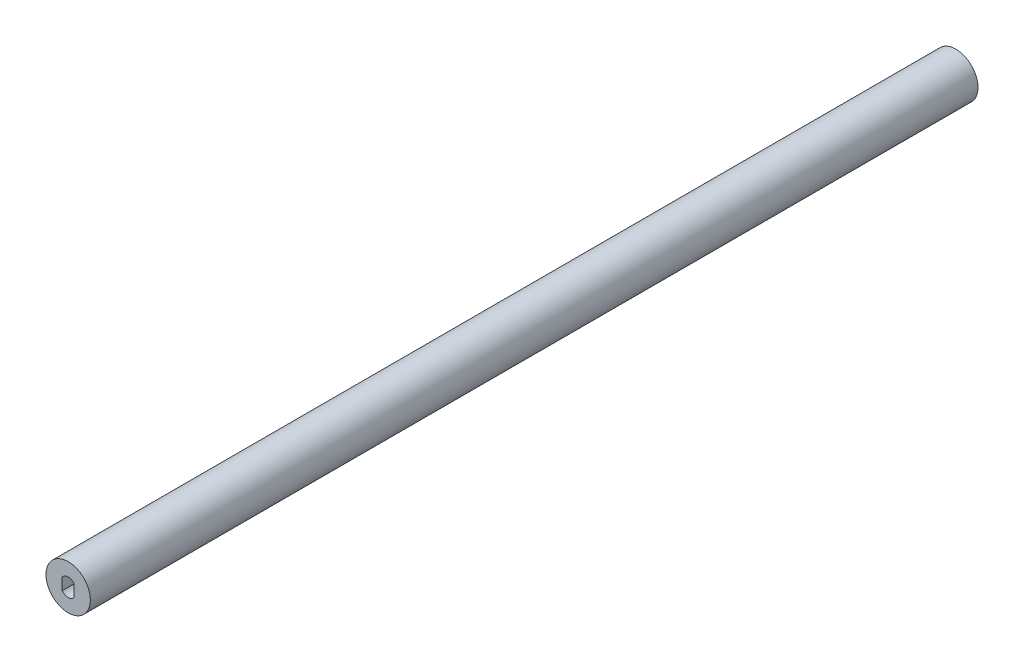
ISO-10303-21;
HEADER;
FILE_DESCRIPTION(('STEP AP214'),'2;1');
FILE_NAME('part.step','',(''),(''),'','','');
FILE_SCHEMA(('AUTOMOTIVE_DESIGN { 1 0 10303 214 1 1 1 1 }'));
ENDSEC;
DATA;
#1=APPLICATION_CONTEXT('core data for automotive mechanical design processes');
#2=APPLICATION_PROTOCOL_DEFINITION('international standard','automotive_design',2000,#1);
#3=PRODUCT_CONTEXT('',#1,'mechanical');
#4=PRODUCT('Part','Part','',(#3));
#5=PRODUCT_RELATED_PRODUCT_CATEGORY('part','',(#4));
#6=PRODUCT_DEFINITION_FORMATION('','',#4);
#7=PRODUCT_DEFINITION_CONTEXT('part definition',#1,'design');
#8=PRODUCT_DEFINITION('design','',#6,#7);
#9=PRODUCT_DEFINITION_SHAPE('','',#8);
#10=(LENGTH_UNIT() NAMED_UNIT(*) SI_UNIT(.MILLI.,.METRE.));
#11=(NAMED_UNIT(*) PLANE_ANGLE_UNIT() SI_UNIT($,.RADIAN.));
#12=(NAMED_UNIT(*) SI_UNIT($,.STERADIAN.) SOLID_ANGLE_UNIT());
#13=UNCERTAINTY_MEASURE_WITH_UNIT(LENGTH_MEASURE(1.E-05),#10,'distance_accuracy_value','');
#14=(GEOMETRIC_REPRESENTATION_CONTEXT(3) GLOBAL_UNCERTAINTY_ASSIGNED_CONTEXT((#13)) GLOBAL_UNIT_ASSIGNED_CONTEXT((#10,
#11,#12)) REPRESENTATION_CONTEXT('',''));
#15=CARTESIAN_POINT('',(0.,0.,0.));
#16=DIRECTION('',(0.,0.,1.));
#17=DIRECTION('',(1.,0.,0.));
#18=AXIS2_PLACEMENT_3D('',#15,#16,#17);
#19=CARTESIAN_POINT('',(-21.928145629141,1.41202452717339,300.));
#20=DIRECTION('',(0.,0.,-1.));
#21=DIRECTION('',(-1.,0.,0.));
#22=AXIS2_PLACEMENT_3D('',#19,#20,#21);
#23=CYLINDRICAL_SURFACE('',#22,7.5);
#24=CARTESIAN_POINT('',(-21.928145629141,1.41202452717339,300.));
#25=DIRECTION('',(0.,0.,1.));
#26=DIRECTION('',(1.,0.,0.));
#27=AXIS2_PLACEMENT_3D('',#24,#25,#26);
#28=CIRCLE('',#27,7.5);
#29=CARTESIAN_POINT('',(-14.428145629141,1.41202452717339,300.));
#30=VERTEX_POINT('',#29);
#31=EDGE_CURVE('E11',#30,#30,#28,.T.);
#32=ORIENTED_EDGE('',*,*,#31,.F.);
#33=EDGE_LOOP('',(#32));
#34=FACE_BOUND('',#33,.T.);
#35=CARTESIAN_POINT('',(-21.928145629141,1.41202452717339,0.));
#36=DIRECTION('',(0.,0.,1.));
#37=DIRECTION('',(1.,0.,0.));
#38=AXIS2_PLACEMENT_3D('',#35,#36,#37);
#39=CIRCLE('',#38,7.5);
#40=CARTESIAN_POINT('',(-14.428145629141,1.41202452717339,0.));
#41=VERTEX_POINT('',#40);
#42=EDGE_CURVE('E40',#41,#41,#39,.T.);
#43=ORIENTED_EDGE('',*,*,#42,.T.);
#44=EDGE_LOOP('',(#43));
#45=FACE_BOUND('',#44,.T.);
#46=ADVANCED_FACE('F37',(#34,#45),#23,.T.);
#47=CARTESIAN_POINT('',(-21.928145629141,1.41202452717339,300.));
#48=DIRECTION('',(0.,0.,1.));
#49=DIRECTION('',(1.,0.,0.));
#50=AXIS2_PLACEMENT_3D('',#47,#48,#49);
#51=PLANE('',#50);
#52=CARTESIAN_POINT('',(-21.928145629141,0.912024527173393,300.));
#53=DIRECTION('',(0.,0.,1.));
#54=DIRECTION('',(1.,0.,0.));
#55=AXIS2_PLACEMENT_3D('',#52,#53,#54);
#56=CIRCLE('',#55,2.5);
#57=CARTESIAN_POINT('',(-23.928145629141,-0.587975472826606,300.));
#58=VERTEX_POINT('',#57);
#59=CARTESIAN_POINT('',(-19.928145629141,-0.587975472826605,300.));
#60=VERTEX_POINT('',#59);
#61=EDGE_CURVE('E51',#58,#60,#56,.T.);
#62=ORIENTED_EDGE('',*,*,#61,.F.);
#63=DIRECTION('',(0.,-1.,0.));
#64=VECTOR('',#63,1.);
#65=CARTESIAN_POINT('',(-23.928145629141,3.41202452717339,300.));
#66=LINE('',#65,#64);
#67=CARTESIAN_POINT('',(-23.928145629141,3.4120245271734,300.));
#68=VERTEX_POINT('',#67);
#69=EDGE_CURVE('E102',#68,#58,#66,.T.);
#70=ORIENTED_EDGE('',*,*,#69,.F.);
#71=CARTESIAN_POINT('',(-21.928145629141,1.91202452717339,300.));
#72=DIRECTION('',(0.,0.,1.));
#73=DIRECTION('',(-1.,0.,0.));
#74=AXIS2_PLACEMENT_3D('',#71,#72,#73);
#75=CIRCLE('',#74,2.5);
#76=CARTESIAN_POINT('',(-19.928145629141,3.41202452717339,300.));
#77=VERTEX_POINT('',#76);
#78=EDGE_CURVE('E108',#77,#68,#75,.T.);
#79=ORIENTED_EDGE('',*,*,#78,.F.);
#80=DIRECTION('',(0.,1.,0.));
#81=VECTOR('',#80,1.);
#82=CARTESIAN_POINT('',(-19.928145629141,3.41202452717339,300.));
#83=LINE('',#82,#81);
#84=EDGE_CURVE('E86',#60,#77,#83,.T.);
#85=ORIENTED_EDGE('',*,*,#84,.F.);
#86=EDGE_LOOP('',(#62,#70,#79,#85));
#87=FACE_BOUND('',#86,.T.);
#88=ORIENTED_EDGE('',*,*,#31,.T.);
#89=EDGE_LOOP('',(#88));
#90=FACE_BOUND('',#89,.T.);
#91=ADVANCED_FACE('F114',(#87,#90),#51,.T.);
#92=CARTESIAN_POINT('',(-21.928145629141,1.41202452717339,0.));
#93=DIRECTION('',(0.,0.,1.));
#94=DIRECTION('',(1.,0.,0.));
#95=AXIS2_PLACEMENT_3D('',#92,#93,#94);
#96=PLANE('',#95);
#97=ORIENTED_EDGE('',*,*,#42,.F.);
#98=EDGE_LOOP('',(#97));
#99=FACE_BOUND('',#98,.T.);
#100=ADVANCED_FACE('F126',(#99),#96,.F.);
#101=CARTESIAN_POINT('',(-21.928145629141,0.912024527173393,295.));
#102=DIRECTION('',(0.,0.,1.));
#103=DIRECTION('',(1.,0.,0.));
#104=AXIS2_PLACEMENT_3D('',#101,#102,#103);
#105=CYLINDRICAL_SURFACE('',#104,2.5);
#106=ORIENTED_EDGE('',*,*,#61,.T.);
#107=DIRECTION('',(0.,0.,1.));
#108=VECTOR('',#107,1.);
#109=CARTESIAN_POINT('',(-19.928145629141,-0.587975472826606,295.));
#110=LINE('',#109,#108);
#111=CARTESIAN_POINT('',(-19.928145629141,-0.587975472826606,295.));
#112=VERTEX_POINT('',#111);
#113=EDGE_CURVE('E74',#112,#60,#110,.T.);
#114=ORIENTED_EDGE('',*,*,#113,.F.);
#115=CARTESIAN_POINT('',(-21.928145629141,0.912024527173393,295.));
#116=DIRECTION('',(0.,0.,1.));
#117=DIRECTION('',(1.,0.,0.));
#118=AXIS2_PLACEMENT_3D('',#115,#116,#117);
#119=CIRCLE('',#118,2.5);
#120=CARTESIAN_POINT('',(-23.928145629141,-0.587975472826606,295.));
#121=VERTEX_POINT('',#120);
#122=EDGE_CURVE('E100',#121,#112,#119,.T.);
#123=ORIENTED_EDGE('',*,*,#122,.F.);
#124=DIRECTION('',(0.,0.,1.));
#125=VECTOR('',#124,1.);
#126=CARTESIAN_POINT('',(-23.928145629141,-0.587975472826606,295.));
#127=LINE('',#126,#125);
#128=EDGE_CURVE('E59',#121,#58,#127,.T.);
#129=ORIENTED_EDGE('',*,*,#128,.T.);
#130=EDGE_LOOP('',(#106,#114,#123,#129));
#131=FACE_BOUND('',#130,.T.);
#132=ADVANCED_FACE('F119',(#131),#105,.F.);
#133=CARTESIAN_POINT('',(-23.928145629141,3.41202452717339,295.));
#134=DIRECTION('',(-1.,0.,0.));
#135=DIRECTION('',(0.,0.,1.));
#136=AXIS2_PLACEMENT_3D('',#133,#134,#135);
#137=PLANE('',#136);
#138=ORIENTED_EDGE('',*,*,#69,.T.);
#139=ORIENTED_EDGE('',*,*,#128,.F.);
#140=DIRECTION('',(0.,-1.,0.));
#141=VECTOR('',#140,1.);
#142=CARTESIAN_POINT('',(-23.928145629141,3.41202452717339,295.));
#143=LINE('',#142,#141);
#144=CARTESIAN_POINT('',(-23.928145629141,3.4120245271734,295.));
#145=VERTEX_POINT('',#144);
#146=EDGE_CURVE('E97',#145,#121,#143,.T.);
#147=ORIENTED_EDGE('',*,*,#146,.F.);
#148=DIRECTION('',(0.,0.,1.));
#149=VECTOR('',#148,1.);
#150=CARTESIAN_POINT('',(-23.928145629141,3.4120245271734,295.));
#151=LINE('',#150,#149);
#152=EDGE_CURVE('E90',#145,#68,#151,.T.);
#153=ORIENTED_EDGE('',*,*,#152,.T.);
#154=EDGE_LOOP('',(#138,#139,#147,#153));
#155=FACE_BOUND('',#154,.T.);
#156=ADVANCED_FACE('F117',(#155),#137,.F.);
#157=CARTESIAN_POINT('',(-21.928145629141,1.91202452717339,295.));
#158=DIRECTION('',(0.,0.,1.));
#159=DIRECTION('',(1.,0.,0.));
#160=AXIS2_PLACEMENT_3D('',#157,#158,#159);
#161=CYLINDRICAL_SURFACE('',#160,2.5);
#162=ORIENTED_EDGE('',*,*,#78,.T.);
#163=ORIENTED_EDGE('',*,*,#152,.F.);
#164=CARTESIAN_POINT('',(-21.928145629141,1.91202452717339,295.));
#165=DIRECTION('',(0.,0.,1.));
#166=DIRECTION('',(-1.,0.,0.));
#167=AXIS2_PLACEMENT_3D('',#164,#165,#166);
#168=CIRCLE('',#167,2.5);
#169=CARTESIAN_POINT('',(-19.928145629141,3.41202452717339,295.));
#170=VERTEX_POINT('',#169);
#171=EDGE_CURVE('E93',#170,#145,#168,.T.);
#172=ORIENTED_EDGE('',*,*,#171,.F.);
#173=DIRECTION('',(0.,0.,1.));
#174=VECTOR('',#173,1.);
#175=CARTESIAN_POINT('',(-19.928145629141,3.41202452717339,295.));
#176=LINE('',#175,#174);
#177=EDGE_CURVE('E79',#170,#77,#176,.T.);
#178=ORIENTED_EDGE('',*,*,#177,.T.);
#179=EDGE_LOOP('',(#162,#163,#172,#178));
#180=FACE_BOUND('',#179,.T.);
#181=ADVANCED_FACE('F94',(#180),#161,.F.);
#182=CARTESIAN_POINT('',(-19.928145629141,3.41202452717339,295.));
#183=DIRECTION('',(1.,0.,0.));
#184=DIRECTION('',(0.,0.,-1.));
#185=AXIS2_PLACEMENT_3D('',#182,#183,#184);
#186=PLANE('',#185);
#187=ORIENTED_EDGE('',*,*,#84,.T.);
#188=ORIENTED_EDGE('',*,*,#177,.F.);
#189=DIRECTION('',(0.,1.,0.));
#190=VECTOR('',#189,1.);
#191=CARTESIAN_POINT('',(-19.928145629141,3.41202452717339,295.));
#192=LINE('',#191,#190);
#193=EDGE_CURVE('E83',#112,#170,#192,.T.);
#194=ORIENTED_EDGE('',*,*,#193,.F.);
#195=ORIENTED_EDGE('',*,*,#113,.T.);
#196=EDGE_LOOP('',(#187,#188,#194,#195));
#197=FACE_BOUND('',#196,.T.);
#198=ADVANCED_FACE('F81',(#197),#186,.F.);
#199=CARTESIAN_POINT('',(-21.928145629141,0.912024527173393,295.));
#200=DIRECTION('',(0.,0.,1.));
#201=DIRECTION('',(1.,0.,0.));
#202=AXIS2_PLACEMENT_3D('',#199,#200,#201);
#203=PLANE('',#202);
#204=ORIENTED_EDGE('',*,*,#122,.T.);
#205=ORIENTED_EDGE('',*,*,#193,.T.);
#206=ORIENTED_EDGE('',*,*,#171,.T.);
#207=ORIENTED_EDGE('',*,*,#146,.T.);
#208=EDGE_LOOP('',(#204,#205,#206,#207));
#209=FACE_BOUND('',#208,.T.);
#210=ADVANCED_FACE('F99',(#209),#203,.T.);
#211=CLOSED_SHELL('',(#46,#91,#100,#132,#156,#181,#198,#210));
#212=MANIFOLD_SOLID_BREP('B2',#211);
#213=ADVANCED_BREP_SHAPE_REPRESENTATION('',(#18,#212),#14);
#214=SHAPE_DEFINITION_REPRESENTATION(#9,#213);
ENDSEC;
END-ISO-10303-21;
